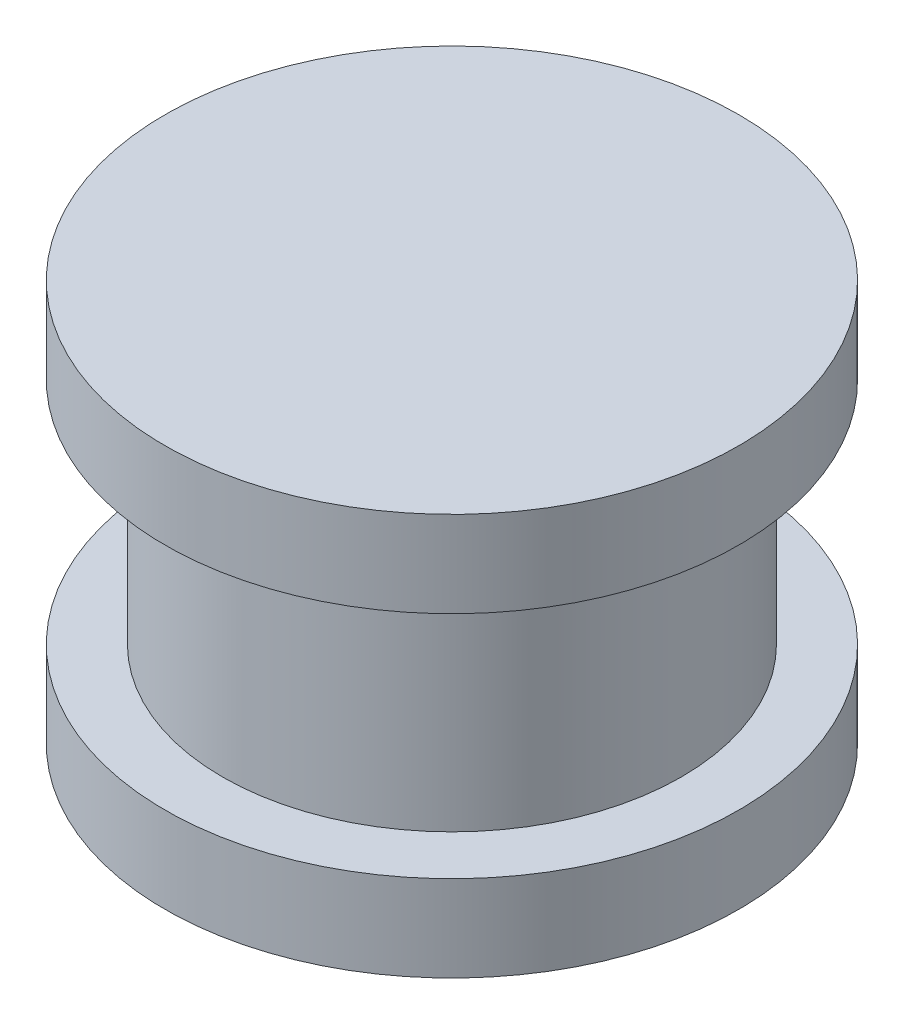
ISO-10303-21;
HEADER;
FILE_DESCRIPTION(('STEP AP214'),'2;1');
FILE_NAME('part.step','',(''),(''),'','','');
FILE_SCHEMA(('AUTOMOTIVE_DESIGN { 1 0 10303 214 1 1 1 1 }'));
ENDSEC;
DATA;
#1=APPLICATION_CONTEXT('core data for automotive mechanical design processes');
#2=APPLICATION_PROTOCOL_DEFINITION('international standard','automotive_design',2000,#1);
#3=PRODUCT_CONTEXT('',#1,'mechanical');
#4=PRODUCT('Part','Part','',(#3));
#5=PRODUCT_RELATED_PRODUCT_CATEGORY('part','',(#4));
#6=PRODUCT_DEFINITION_FORMATION('','',#4);
#7=PRODUCT_DEFINITION_CONTEXT('part definition',#1,'design');
#8=PRODUCT_DEFINITION('design','',#6,#7);
#9=PRODUCT_DEFINITION_SHAPE('','',#8);
#10=(LENGTH_UNIT() NAMED_UNIT(*) SI_UNIT(.MILLI.,.METRE.));
#11=(NAMED_UNIT(*) PLANE_ANGLE_UNIT() SI_UNIT($,.RADIAN.));
#12=(NAMED_UNIT(*) SI_UNIT($,.STERADIAN.) SOLID_ANGLE_UNIT());
#13=UNCERTAINTY_MEASURE_WITH_UNIT(LENGTH_MEASURE(1.E-05),#10,'distance_accuracy_value','');
#14=(GEOMETRIC_REPRESENTATION_CONTEXT(3) GLOBAL_UNCERTAINTY_ASSIGNED_CONTEXT((#13)) GLOBAL_UNIT_ASSIGNED_CONTEXT((#10,
#11,#12)) REPRESENTATION_CONTEXT('',''));
#15=CARTESIAN_POINT('',(0.,0.,0.));
#16=DIRECTION('',(0.,0.,1.));
#17=DIRECTION('',(1.,0.,0.));
#18=AXIS2_PLACEMENT_3D('',#15,#16,#17);
#19=CARTESIAN_POINT('',(0.,-0.2415,0.));
#20=DIRECTION('',(0.,-1.,0.));
#21=DIRECTION('',(0.,0.,-1.));
#22=AXIS2_PLACEMENT_3D('',#19,#20,#21);
#23=CYLINDRICAL_SURFACE('',#22,0.276);
#24=CARTESIAN_POINT('',(0.,0.138,0.));
#25=DIRECTION('',(0.,-1.,0.));
#26=DIRECTION('',(0.,0.,-1.));
#27=AXIS2_PLACEMENT_3D('',#24,#25,#26);
#28=CIRCLE('',#27,0.276);
#29=CARTESIAN_POINT('',(0.,0.138,-0.276));
#30=VERTEX_POINT('',#29);
#31=EDGE_CURVE('E10',#30,#30,#28,.T.);
#32=ORIENTED_EDGE('',*,*,#31,.T.);
#33=EDGE_LOOP('',(#32));
#34=FACE_BOUND('',#33,.T.);
#35=CARTESIAN_POINT('',(0.,-0.138,0.));
#36=DIRECTION('',(0.,-1.,0.));
#37=DIRECTION('',(0.,0.,-1.));
#38=AXIS2_PLACEMENT_3D('',#35,#36,#37);
#39=CIRCLE('',#38,0.276);
#40=CARTESIAN_POINT('',(0.,-0.138,-0.276));
#41=VERTEX_POINT('',#40);
#42=EDGE_CURVE('E58',#41,#41,#39,.T.);
#43=ORIENTED_EDGE('',*,*,#42,.F.);
#44=EDGE_LOOP('',(#43));
#45=FACE_BOUND('',#44,.T.);
#46=ADVANCED_FACE('F36',(#34,#45),#23,.T.);
#47=CARTESIAN_POINT('',(0.345,0.138,0.));
#48=DIRECTION('',(0.,-1.,0.));
#49=DIRECTION('',(0.,0.,-1.));
#50=AXIS2_PLACEMENT_3D('',#47,#48,#49);
#51=PLANE('',#50);
#52=CARTESIAN_POINT('',(0.,0.138,0.));
#53=DIRECTION('',(0.,-1.,0.));
#54=DIRECTION('',(0.,0.,-1.));
#55=AXIS2_PLACEMENT_3D('',#52,#53,#54);
#56=CIRCLE('',#55,0.345);
#57=CARTESIAN_POINT('',(0.,0.138,-0.345));
#58=VERTEX_POINT('',#57);
#59=EDGE_CURVE('E42',#58,#58,#56,.T.);
#60=ORIENTED_EDGE('',*,*,#59,.T.);
#61=EDGE_LOOP('',(#60));
#62=FACE_BOUND('',#61,.T.);
#63=ORIENTED_EDGE('',*,*,#31,.F.);
#64=EDGE_LOOP('',(#63));
#65=FACE_BOUND('',#64,.T.);
#66=ADVANCED_FACE('F66',(#62,#65),#51,.T.);
#67=CARTESIAN_POINT('',(0.,-0.2415,0.));
#68=DIRECTION('',(0.,-1.,0.));
#69=DIRECTION('',(0.,0.,-1.));
#70=AXIS2_PLACEMENT_3D('',#67,#68,#69);
#71=CYLINDRICAL_SURFACE('',#70,0.345);
#72=CARTESIAN_POINT('',(0.,0.2415,0.));
#73=DIRECTION('',(0.,-1.,0.));
#74=DIRECTION('',(0.,0.,-1.));
#75=AXIS2_PLACEMENT_3D('',#72,#73,#74);
#76=CIRCLE('',#75,0.345);
#77=CARTESIAN_POINT('',(0.,0.2415,-0.345));
#78=VERTEX_POINT('',#77);
#79=EDGE_CURVE('E46',#78,#78,#76,.T.);
#80=ORIENTED_EDGE('',*,*,#79,.T.);
#81=EDGE_LOOP('',(#80));
#82=FACE_BOUND('',#81,.T.);
#83=ORIENTED_EDGE('',*,*,#59,.F.);
#84=EDGE_LOOP('',(#83));
#85=FACE_BOUND('',#84,.T.);
#86=ADVANCED_FACE('F70',(#82,#85),#71,.T.);
#87=CARTESIAN_POINT('',(0.,0.2415,0.));
#88=DIRECTION('',(0.,1.,0.));
#89=DIRECTION('',(0.,0.,1.));
#90=AXIS2_PLACEMENT_3D('',#87,#88,#89);
#91=PLANE('',#90);
#92=ORIENTED_EDGE('',*,*,#79,.F.);
#93=EDGE_LOOP('',(#92));
#94=FACE_BOUND('',#93,.T.);
#95=ADVANCED_FACE('F74',(#94),#91,.T.);
#96=CARTESIAN_POINT('',(0.345,-0.2415,0.));
#97=DIRECTION('',(0.,-1.,0.));
#98=DIRECTION('',(0.,0.,-1.));
#99=AXIS2_PLACEMENT_3D('',#96,#97,#98);
#100=PLANE('',#99);
#101=CARTESIAN_POINT('',(0.,-0.2415,0.));
#102=DIRECTION('',(0.,-1.,0.));
#103=DIRECTION('',(0.,0.,-1.));
#104=AXIS2_PLACEMENT_3D('',#101,#102,#103);
#105=CIRCLE('',#104,0.345);
#106=CARTESIAN_POINT('',(0.,-0.2415,-0.345));
#107=VERTEX_POINT('',#106);
#108=EDGE_CURVE('E50',#107,#107,#105,.T.);
#109=ORIENTED_EDGE('',*,*,#108,.T.);
#110=EDGE_LOOP('',(#109));
#111=FACE_BOUND('',#110,.T.);
#112=ADVANCED_FACE('F81',(#111),#100,.T.);
#113=CARTESIAN_POINT('',(0.,-0.2415,0.));
#114=DIRECTION('',(0.,-1.,0.));
#115=DIRECTION('',(0.,0.,-1.));
#116=AXIS2_PLACEMENT_3D('',#113,#114,#115);
#117=CYLINDRICAL_SURFACE('',#116,0.345);
#118=CARTESIAN_POINT('',(0.,-0.138,0.));
#119=DIRECTION('',(0.,-1.,0.));
#120=DIRECTION('',(0.,0.,-1.));
#121=AXIS2_PLACEMENT_3D('',#118,#119,#120);
#122=CIRCLE('',#121,0.345);
#123=CARTESIAN_POINT('',(0.,-0.138,-0.345));
#124=VERTEX_POINT('',#123);
#125=EDGE_CURVE('E55',#124,#124,#122,.T.);
#126=ORIENTED_EDGE('',*,*,#125,.T.);
#127=EDGE_LOOP('',(#126));
#128=FACE_BOUND('',#127,.T.);
#129=ORIENTED_EDGE('',*,*,#108,.F.);
#130=EDGE_LOOP('',(#129));
#131=FACE_BOUND('',#130,.T.);
#132=ADVANCED_FACE('F85',(#128,#131),#117,.T.);
#133=CARTESIAN_POINT('',(0.276,-0.138,0.));
#134=DIRECTION('',(0.,1.,0.));
#135=DIRECTION('',(0.,0.,1.));
#136=AXIS2_PLACEMENT_3D('',#133,#134,#135);
#137=PLANE('',#136);
#138=ORIENTED_EDGE('',*,*,#42,.T.);
#139=EDGE_LOOP('',(#138));
#140=FACE_BOUND('',#139,.T.);
#141=ORIENTED_EDGE('',*,*,#125,.F.);
#142=EDGE_LOOP('',(#141));
#143=FACE_BOUND('',#142,.T.);
#144=ADVANCED_FACE('F62',(#140,#143),#137,.T.);
#145=CLOSED_SHELL('',(#46,#66,#86,#95,#112,#132,#144));
#146=MANIFOLD_SOLID_BREP('B2',#145);
#147=ADVANCED_BREP_SHAPE_REPRESENTATION('',(#18,#146),#14);
#148=SHAPE_DEFINITION_REPRESENTATION(#9,#147);
ENDSEC;
END-ISO-10303-21;
